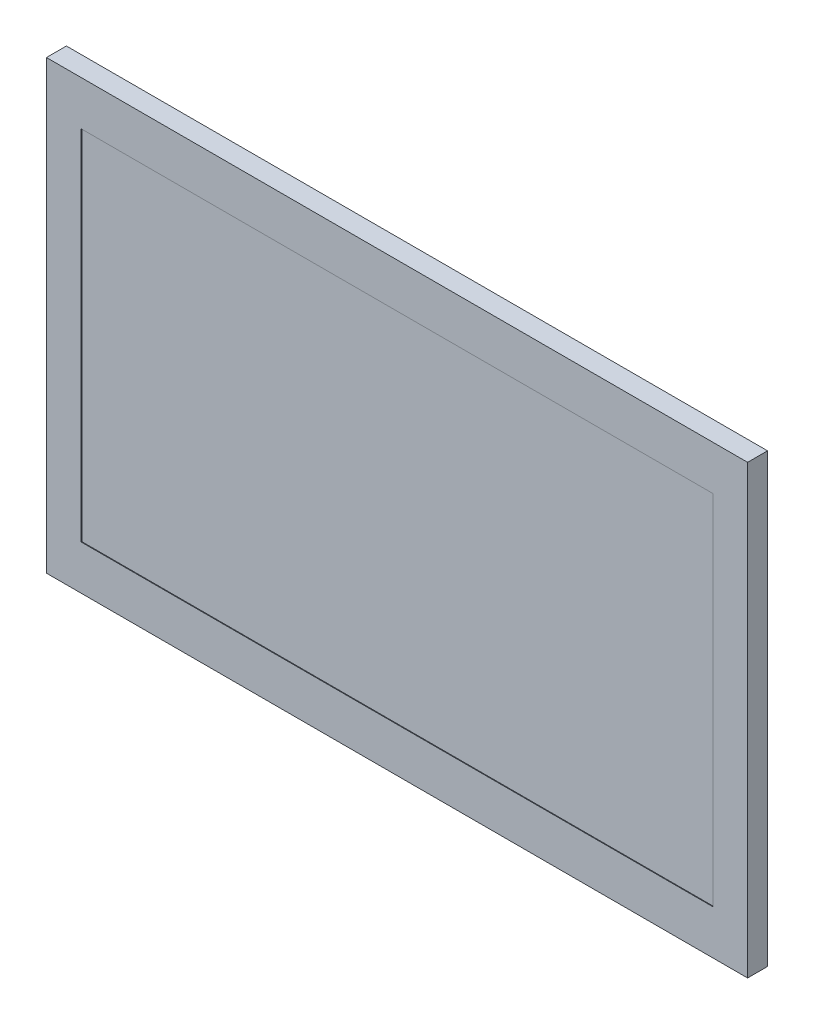
ISO-10303-21;
HEADER;
FILE_DESCRIPTION(('STEP AP214'),'2;1');
FILE_NAME('part.step','',(''),(''),'','','');
FILE_SCHEMA(('AUTOMOTIVE_DESIGN { 1 0 10303 214 1 1 1 1 }'));
ENDSEC;
DATA;
#1=APPLICATION_CONTEXT('core data for automotive mechanical design processes');
#2=APPLICATION_PROTOCOL_DEFINITION('international standard','automotive_design',2000,#1);
#3=PRODUCT_CONTEXT('',#1,'mechanical');
#4=PRODUCT('Part','Part','',(#3));
#5=PRODUCT_RELATED_PRODUCT_CATEGORY('part','',(#4));
#6=PRODUCT_DEFINITION_FORMATION('','',#4);
#7=PRODUCT_DEFINITION_CONTEXT('part definition',#1,'design');
#8=PRODUCT_DEFINITION('design','',#6,#7);
#9=PRODUCT_DEFINITION_SHAPE('','',#8);
#10=(LENGTH_UNIT() NAMED_UNIT(*) SI_UNIT(.MILLI.,.METRE.));
#11=(NAMED_UNIT(*) PLANE_ANGLE_UNIT() SI_UNIT($,.RADIAN.));
#12=(NAMED_UNIT(*) SI_UNIT($,.STERADIAN.) SOLID_ANGLE_UNIT());
#13=UNCERTAINTY_MEASURE_WITH_UNIT(LENGTH_MEASURE(1.E-05),#10,'distance_accuracy_value','');
#14=(GEOMETRIC_REPRESENTATION_CONTEXT(3) GLOBAL_UNCERTAINTY_ASSIGNED_CONTEXT((#13)) GLOBAL_UNIT_ASSIGNED_CONTEXT((#10,
#11,#12)) REPRESENTATION_CONTEXT('',''));
#15=CARTESIAN_POINT('',(0.,0.,0.));
#16=DIRECTION('',(0.,0.,1.));
#17=DIRECTION('',(1.,0.,0.));
#18=AXIS2_PLACEMENT_3D('',#15,#16,#17);
#19=CARTESIAN_POINT('',(52.75,-33.6,3.));
#20=DIRECTION('',(-1.,0.,0.));
#21=DIRECTION('',(0.,0.,1.));
#22=AXIS2_PLACEMENT_3D('',#19,#20,#21);
#23=PLANE('',#22);
#24=DIRECTION('',(0.,1.,0.));
#25=VECTOR('',#24,1.);
#26=CARTESIAN_POINT('',(52.75,-33.6,0.));
#27=LINE('',#26,#25);
#28=CARTESIAN_POINT('',(52.75,-33.6,0.));
#29=VERTEX_POINT('',#28);
#30=CARTESIAN_POINT('',(52.75,33.6,0.));
#31=VERTEX_POINT('',#30);
#32=EDGE_CURVE('E142',#29,#31,#27,.T.);
#33=ORIENTED_EDGE('',*,*,#32,.T.);
#34=DIRECTION('',(0.,0.,-1.));
#35=VECTOR('',#34,1.);
#36=CARTESIAN_POINT('',(52.75,33.6,3.));
#37=LINE('',#36,#35);
#38=CARTESIAN_POINT('',(52.75,33.6,3.));
#39=VERTEX_POINT('',#38);
#40=EDGE_CURVE('E11',#39,#31,#37,.T.);
#41=ORIENTED_EDGE('',*,*,#40,.F.);
#42=DIRECTION('',(0.,1.,0.));
#43=VECTOR('',#42,1.);
#44=CARTESIAN_POINT('',(52.75,-33.6,3.));
#45=LINE('',#44,#43);
#46=CARTESIAN_POINT('',(52.75,-33.6,3.));
#47=VERTEX_POINT('',#46);
#48=EDGE_CURVE('E146',#47,#39,#45,.T.);
#49=ORIENTED_EDGE('',*,*,#48,.F.);
#50=DIRECTION('',(0.,0.,-1.));
#51=VECTOR('',#50,1.);
#52=CARTESIAN_POINT('',(52.75,-33.6,3.));
#53=LINE('',#52,#51);
#54=EDGE_CURVE('E152',#47,#29,#53,.T.);
#55=ORIENTED_EDGE('',*,*,#54,.T.);
#56=EDGE_LOOP('',(#33,#41,#49,#55));
#57=FACE_BOUND('',#56,.T.);
#58=ADVANCED_FACE('F34',(#57),#23,.F.);
#59=CARTESIAN_POINT('',(-52.75,33.6,3.));
#60=DIRECTION('',(0.,-1.,0.));
#61=DIRECTION('',(0.,0.,-1.));
#62=AXIS2_PLACEMENT_3D('',#59,#60,#61);
#63=PLANE('',#62);
#64=DIRECTION('',(-1.,0.,0.));
#65=VECTOR('',#64,1.);
#66=CARTESIAN_POINT('',(-52.75,33.6,0.));
#67=LINE('',#66,#65);
#68=CARTESIAN_POINT('',(-52.75,33.6,0.));
#69=VERTEX_POINT('',#68);
#70=EDGE_CURVE('E155',#31,#69,#67,.T.);
#71=ORIENTED_EDGE('',*,*,#70,.T.);
#72=DIRECTION('',(0.,0.,-1.));
#73=VECTOR('',#72,1.);
#74=CARTESIAN_POINT('',(-52.75,33.6,3.));
#75=LINE('',#74,#73);
#76=CARTESIAN_POINT('',(-52.75,33.6,3.));
#77=VERTEX_POINT('',#76);
#78=EDGE_CURVE('E41',#77,#69,#75,.T.);
#79=ORIENTED_EDGE('',*,*,#78,.F.);
#80=DIRECTION('',(-1.,0.,0.));
#81=VECTOR('',#80,1.);
#82=CARTESIAN_POINT('',(-52.75,33.6,3.));
#83=LINE('',#82,#81);
#84=EDGE_CURVE('E85',#39,#77,#83,.T.);
#85=ORIENTED_EDGE('',*,*,#84,.F.);
#86=ORIENTED_EDGE('',*,*,#40,.T.);
#87=EDGE_LOOP('',(#71,#79,#85,#86));
#88=FACE_BOUND('',#87,.T.);
#89=ADVANCED_FACE('F184',(#88),#63,.F.);
#90=CARTESIAN_POINT('',(-52.75,-33.6,3.));
#91=DIRECTION('',(1.,0.,0.));
#92=DIRECTION('',(0.,0.,-1.));
#93=AXIS2_PLACEMENT_3D('',#90,#91,#92);
#94=PLANE('',#93);
#95=DIRECTION('',(0.,-1.,0.));
#96=VECTOR('',#95,1.);
#97=CARTESIAN_POINT('',(-52.75,-33.6,0.));
#98=LINE('',#97,#96);
#99=CARTESIAN_POINT('',(-52.75,-33.6,0.));
#100=VERTEX_POINT('',#99);
#101=EDGE_CURVE('E157',#69,#100,#98,.T.);
#102=ORIENTED_EDGE('',*,*,#101,.T.);
#103=DIRECTION('',(0.,0.,-1.));
#104=VECTOR('',#103,1.);
#105=CARTESIAN_POINT('',(-52.75,-33.6,3.));
#106=LINE('',#105,#104);
#107=CARTESIAN_POINT('',(-52.75,-33.6,3.));
#108=VERTEX_POINT('',#107);
#109=EDGE_CURVE('E161',#108,#100,#106,.T.);
#110=ORIENTED_EDGE('',*,*,#109,.F.);
#111=DIRECTION('',(0.,-1.,0.));
#112=VECTOR('',#111,1.);
#113=CARTESIAN_POINT('',(-52.75,-33.6,3.));
#114=LINE('',#113,#112);
#115=EDGE_CURVE('E149',#77,#108,#114,.T.);
#116=ORIENTED_EDGE('',*,*,#115,.F.);
#117=ORIENTED_EDGE('',*,*,#78,.T.);
#118=EDGE_LOOP('',(#102,#110,#116,#117));
#119=FACE_BOUND('',#118,.T.);
#120=ADVANCED_FACE('F166',(#119),#94,.F.);
#121=CARTESIAN_POINT('',(-52.75,-33.6,3.));
#122=DIRECTION('',(0.,1.,0.));
#123=DIRECTION('',(0.,0.,1.));
#124=AXIS2_PLACEMENT_3D('',#121,#122,#123);
#125=PLANE('',#124);
#126=DIRECTION('',(1.,0.,0.));
#127=VECTOR('',#126,1.);
#128=CARTESIAN_POINT('',(-52.75,-33.6,0.));
#129=LINE('',#128,#127);
#130=EDGE_CURVE('E78',#100,#29,#129,.T.);
#131=ORIENTED_EDGE('',*,*,#130,.T.);
#132=ORIENTED_EDGE('',*,*,#54,.F.);
#133=DIRECTION('',(1.,0.,0.));
#134=VECTOR('',#133,1.);
#135=CARTESIAN_POINT('',(-52.75,-33.6,3.));
#136=LINE('',#135,#134);
#137=EDGE_CURVE('E57',#108,#47,#136,.T.);
#138=ORIENTED_EDGE('',*,*,#137,.F.);
#139=ORIENTED_EDGE('',*,*,#109,.T.);
#140=EDGE_LOOP('',(#131,#132,#138,#139));
#141=FACE_BOUND('',#140,.T.);
#142=ADVANCED_FACE('F174',(#141),#125,.F.);
#143=CARTESIAN_POINT('',(0.,0.,3.));
#144=DIRECTION('',(0.,0.,-1.));
#145=DIRECTION('',(-1.,0.,0.));
#146=AXIS2_PLACEMENT_3D('',#143,#144,#145);
#147=PLANE('',#146);
#148=DIRECTION('',(-1.,0.,0.));
#149=VECTOR('',#148,1.);
#150=CARTESIAN_POINT('',(-47.52,26.925,3.));
#151=LINE('',#150,#149);
#152=CARTESIAN_POINT('',(47.52,26.925,3.));
#153=VERTEX_POINT('',#152);
#154=CARTESIAN_POINT('',(-47.52,26.925,3.));
#155=VERTEX_POINT('',#154);
#156=EDGE_CURVE('E136',#153,#155,#151,.T.);
#157=ORIENTED_EDGE('',*,*,#156,.F.);
#158=DIRECTION('',(0.,1.,0.));
#159=VECTOR('',#158,1.);
#160=CARTESIAN_POINT('',(47.52,26.925,3.));
#161=LINE('',#160,#159);
#162=CARTESIAN_POINT('',(47.52,-26.925,3.));
#163=VERTEX_POINT('',#162);
#164=EDGE_CURVE('E48',#163,#153,#161,.T.);
#165=ORIENTED_EDGE('',*,*,#164,.F.);
#166=DIRECTION('',(1.,0.,0.));
#167=VECTOR('',#166,1.);
#168=CARTESIAN_POINT('',(-47.52,-26.925,3.));
#169=LINE('',#168,#167);
#170=CARTESIAN_POINT('',(-47.52,-26.925,3.));
#171=VERTEX_POINT('',#170);
#172=EDGE_CURVE('E127',#171,#163,#169,.T.);
#173=ORIENTED_EDGE('',*,*,#172,.F.);
#174=DIRECTION('',(0.,-1.,0.));
#175=VECTOR('',#174,1.);
#176=CARTESIAN_POINT('',(-47.52,26.925,3.));
#177=LINE('',#176,#175);
#178=EDGE_CURVE('E130',#155,#171,#177,.T.);
#179=ORIENTED_EDGE('',*,*,#178,.F.);
#180=EDGE_LOOP('',(#157,#165,#173,#179));
#181=FACE_BOUND('',#180,.T.);
#182=ORIENTED_EDGE('',*,*,#48,.T.);
#183=ORIENTED_EDGE('',*,*,#84,.T.);
#184=ORIENTED_EDGE('',*,*,#115,.T.);
#185=ORIENTED_EDGE('',*,*,#137,.T.);
#186=EDGE_LOOP('',(#182,#183,#184,#185));
#187=FACE_BOUND('',#186,.T.);
#188=ADVANCED_FACE('F176',(#181,#187),#147,.F.);
#189=CARTESIAN_POINT('',(0.,0.,0.));
#190=DIRECTION('',(0.,0.,-1.));
#191=DIRECTION('',(-1.,0.,0.));
#192=AXIS2_PLACEMENT_3D('',#189,#190,#191);
#193=PLANE('',#192);
#194=ORIENTED_EDGE('',*,*,#32,.F.);
#195=ORIENTED_EDGE('',*,*,#130,.F.);
#196=ORIENTED_EDGE('',*,*,#101,.F.);
#197=ORIENTED_EDGE('',*,*,#70,.F.);
#198=EDGE_LOOP('',(#194,#195,#196,#197));
#199=FACE_BOUND('',#198,.T.);
#200=ADVANCED_FACE('F170',(#199),#193,.T.);
#201=CARTESIAN_POINT('',(47.52,26.925,2.9));
#202=DIRECTION('',(1.,0.,0.));
#203=DIRECTION('',(0.,0.,-1.));
#204=AXIS2_PLACEMENT_3D('',#201,#202,#203);
#205=PLANE('',#204);
#206=ORIENTED_EDGE('',*,*,#164,.T.);
#207=DIRECTION('',(0.,0.,1.));
#208=VECTOR('',#207,1.);
#209=CARTESIAN_POINT('',(47.52,26.925,2.9));
#210=LINE('',#209,#208);
#211=CARTESIAN_POINT('',(47.52,26.925,2.9));
#212=VERTEX_POINT('',#211);
#213=EDGE_CURVE('E105',#212,#153,#210,.T.);
#214=ORIENTED_EDGE('',*,*,#213,.F.);
#215=DIRECTION('',(0.,1.,0.));
#216=VECTOR('',#215,1.);
#217=CARTESIAN_POINT('',(47.52,26.925,2.9));
#218=LINE('',#217,#216);
#219=CARTESIAN_POINT('',(47.52,-26.925,2.9));
#220=VERTEX_POINT('',#219);
#221=EDGE_CURVE('E109',#220,#212,#218,.T.);
#222=ORIENTED_EDGE('',*,*,#221,.F.);
#223=DIRECTION('',(0.,0.,1.));
#224=VECTOR('',#223,1.);
#225=CARTESIAN_POINT('',(47.52,-26.925,2.9));
#226=LINE('',#225,#224);
#227=EDGE_CURVE('E140',#220,#163,#226,.T.);
#228=ORIENTED_EDGE('',*,*,#227,.T.);
#229=EDGE_LOOP('',(#206,#214,#222,#228));
#230=FACE_BOUND('',#229,.T.);
#231=ADVANCED_FACE('F107',(#230),#205,.F.);
#232=CARTESIAN_POINT('',(-47.52,-26.925,2.9));
#233=DIRECTION('',(0.,-1.,0.));
#234=DIRECTION('',(0.,0.,-1.));
#235=AXIS2_PLACEMENT_3D('',#232,#233,#234);
#236=PLANE('',#235);
#237=ORIENTED_EDGE('',*,*,#172,.T.);
#238=ORIENTED_EDGE('',*,*,#227,.F.);
#239=DIRECTION('',(1.,0.,0.));
#240=VECTOR('',#239,1.);
#241=CARTESIAN_POINT('',(-47.52,-26.925,2.9));
#242=LINE('',#241,#240);
#243=CARTESIAN_POINT('',(-47.52,-26.925,2.9));
#244=VERTEX_POINT('',#243);
#245=EDGE_CURVE('E115',#244,#220,#242,.T.);
#246=ORIENTED_EDGE('',*,*,#245,.F.);
#247=DIRECTION('',(0.,0.,1.));
#248=VECTOR('',#247,1.);
#249=CARTESIAN_POINT('',(-47.52,-26.925,2.9));
#250=LINE('',#249,#248);
#251=EDGE_CURVE('E143',#244,#171,#250,.T.);
#252=ORIENTED_EDGE('',*,*,#251,.T.);
#253=EDGE_LOOP('',(#237,#238,#246,#252));
#254=FACE_BOUND('',#253,.T.);
#255=ADVANCED_FACE('F223',(#254),#236,.F.);
#256=CARTESIAN_POINT('',(-47.52,26.925,2.9));
#257=DIRECTION('',(-1.,0.,0.));
#258=DIRECTION('',(0.,0.,1.));
#259=AXIS2_PLACEMENT_3D('',#256,#257,#258);
#260=PLANE('',#259);
#261=ORIENTED_EDGE('',*,*,#178,.T.);
#262=ORIENTED_EDGE('',*,*,#251,.F.);
#263=DIRECTION('',(0.,-1.,0.));
#264=VECTOR('',#263,1.);
#265=CARTESIAN_POINT('',(-47.52,26.925,2.9));
#266=LINE('',#265,#264);
#267=CARTESIAN_POINT('',(-47.52,26.925,2.9));
#268=VERTEX_POINT('',#267);
#269=EDGE_CURVE('E123',#268,#244,#266,.T.);
#270=ORIENTED_EDGE('',*,*,#269,.F.);
#271=DIRECTION('',(0.,0.,1.));
#272=VECTOR('',#271,1.);
#273=CARTESIAN_POINT('',(-47.52,26.925,2.9));
#274=LINE('',#273,#272);
#275=EDGE_CURVE('E114',#268,#155,#274,.T.);
#276=ORIENTED_EDGE('',*,*,#275,.T.);
#277=EDGE_LOOP('',(#261,#262,#270,#276));
#278=FACE_BOUND('',#277,.T.);
#279=ADVANCED_FACE('F232',(#278),#260,.F.);
#280=CARTESIAN_POINT('',(-47.52,26.925,2.9));
#281=DIRECTION('',(0.,1.,0.));
#282=DIRECTION('',(0.,0.,1.));
#283=AXIS2_PLACEMENT_3D('',#280,#281,#282);
#284=PLANE('',#283);
#285=ORIENTED_EDGE('',*,*,#156,.T.);
#286=ORIENTED_EDGE('',*,*,#275,.F.);
#287=DIRECTION('',(-1.,0.,0.));
#288=VECTOR('',#287,1.);
#289=CARTESIAN_POINT('',(-47.52,26.925,2.9));
#290=LINE('',#289,#288);
#291=EDGE_CURVE('E118',#212,#268,#290,.T.);
#292=ORIENTED_EDGE('',*,*,#291,.F.);
#293=ORIENTED_EDGE('',*,*,#213,.T.);
#294=EDGE_LOOP('',(#285,#286,#292,#293));
#295=FACE_BOUND('',#294,.T.);
#296=ADVANCED_FACE('F119',(#295),#284,.F.);
#297=CARTESIAN_POINT('',(0.,0.,2.9));
#298=DIRECTION('',(0.,0.,1.));
#299=DIRECTION('',(1.,0.,0.));
#300=AXIS2_PLACEMENT_3D('',#297,#298,#299);
#301=PLANE('',#300);
#302=ORIENTED_EDGE('',*,*,#221,.T.);
#303=ORIENTED_EDGE('',*,*,#291,.T.);
#304=ORIENTED_EDGE('',*,*,#269,.T.);
#305=ORIENTED_EDGE('',*,*,#245,.T.);
#306=EDGE_LOOP('',(#302,#303,#304,#305));
#307=FACE_BOUND('',#306,.T.);
#308=ADVANCED_FACE('F125',(#307),#301,.T.);
#309=CLOSED_SHELL('',(#58,#89,#120,#142,#188,#200,#231,#255,#279,#296,#308));
#310=MANIFOLD_SOLID_BREP('B2',#309);
#311=ADVANCED_BREP_SHAPE_REPRESENTATION('',(#18,#310),#14);
#312=SHAPE_DEFINITION_REPRESENTATION(#9,#311);
ENDSEC;
END-ISO-10303-21;
